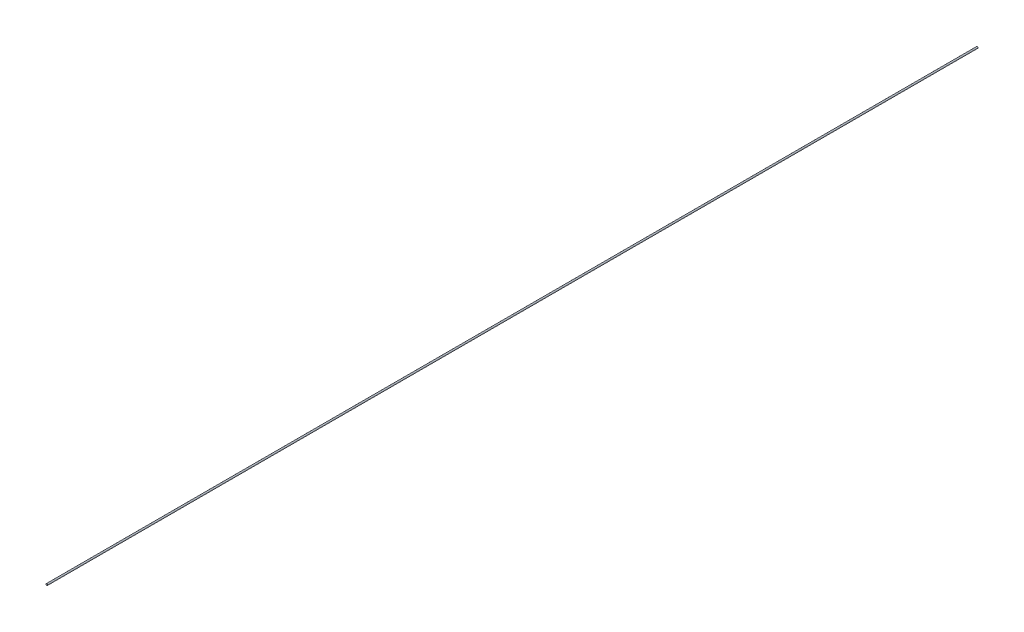
ISO-10303-21;
HEADER;
FILE_DESCRIPTION(('STEP AP214'),'2;1');
FILE_NAME('part.step','',(''),(''),'','','');
FILE_SCHEMA(('AUTOMOTIVE_DESIGN { 1 0 10303 214 1 1 1 1 }'));
ENDSEC;
DATA;
#1=APPLICATION_CONTEXT('core data for automotive mechanical design processes');
#2=APPLICATION_PROTOCOL_DEFINITION('international standard','automotive_design',2000,#1);
#3=PRODUCT_CONTEXT('',#1,'mechanical');
#4=PRODUCT('Part','Part','',(#3));
#5=PRODUCT_RELATED_PRODUCT_CATEGORY('part','',(#4));
#6=PRODUCT_DEFINITION_FORMATION('','',#4);
#7=PRODUCT_DEFINITION_CONTEXT('part definition',#1,'design');
#8=PRODUCT_DEFINITION('design','',#6,#7);
#9=PRODUCT_DEFINITION_SHAPE('','',#8);
#10=(LENGTH_UNIT() NAMED_UNIT(*) SI_UNIT(.MILLI.,.METRE.));
#11=(NAMED_UNIT(*) PLANE_ANGLE_UNIT() SI_UNIT($,.RADIAN.));
#12=(NAMED_UNIT(*) SI_UNIT($,.STERADIAN.) SOLID_ANGLE_UNIT());
#13=UNCERTAINTY_MEASURE_WITH_UNIT(LENGTH_MEASURE(1.E-05),#10,'distance_accuracy_value','');
#14=(GEOMETRIC_REPRESENTATION_CONTEXT(3) GLOBAL_UNCERTAINTY_ASSIGNED_CONTEXT((#13)) GLOBAL_UNIT_ASSIGNED_CONTEXT((#10,
#11,#12)) REPRESENTATION_CONTEXT('',''));
#15=CARTESIAN_POINT('',(0.,0.,0.));
#16=DIRECTION('',(0.,0.,1.));
#17=DIRECTION('',(1.,0.,0.));
#18=AXIS2_PLACEMENT_3D('',#15,#16,#17);
#19=CARTESIAN_POINT('',(0.,0.,400.));
#20=DIRECTION('',(0.,0.,-1.));
#21=DIRECTION('',(-1.,0.,0.));
#22=AXIS2_PLACEMENT_3D('',#19,#20,#21);
#23=CYLINDRICAL_SURFACE('',#22,0.33);
#24=CARTESIAN_POINT('',(0.,0.,400.));
#25=DIRECTION('',(0.,0.,1.));
#26=DIRECTION('',(1.,0.,0.));
#27=AXIS2_PLACEMENT_3D('',#24,#25,#26);
#28=CIRCLE('',#27,0.33);
#29=CARTESIAN_POINT('',(0.33,0.,400.));
#30=VERTEX_POINT('',#29);
#31=EDGE_CURVE('E10',#30,#30,#28,.T.);
#32=ORIENTED_EDGE('',*,*,#31,.F.);
#33=EDGE_LOOP('',(#32));
#34=FACE_BOUND('',#33,.T.);
#35=CARTESIAN_POINT('',(0.,0.,0.));
#36=DIRECTION('',(0.,0.,1.));
#37=DIRECTION('',(1.,0.,0.));
#38=AXIS2_PLACEMENT_3D('',#35,#36,#37);
#39=CIRCLE('',#38,0.33);
#40=CARTESIAN_POINT('',(0.33,0.,0.));
#41=VERTEX_POINT('',#40);
#42=EDGE_CURVE('E33',#41,#41,#39,.T.);
#43=ORIENTED_EDGE('',*,*,#42,.T.);
#44=EDGE_LOOP('',(#43));
#45=FACE_BOUND('',#44,.T.);
#46=ADVANCED_FACE('F30',(#34,#45),#23,.T.);
#47=CARTESIAN_POINT('',(0.,0.,400.));
#48=DIRECTION('',(0.,0.,1.));
#49=DIRECTION('',(1.,0.,0.));
#50=AXIS2_PLACEMENT_3D('',#47,#48,#49);
#51=PLANE('',#50);
#52=ORIENTED_EDGE('',*,*,#31,.T.);
#53=EDGE_LOOP('',(#52));
#54=FACE_BOUND('',#53,.T.);
#55=ADVANCED_FACE('F45',(#54),#51,.T.);
#56=CARTESIAN_POINT('',(0.,0.,0.));
#57=DIRECTION('',(0.,0.,1.));
#58=DIRECTION('',(1.,0.,0.));
#59=AXIS2_PLACEMENT_3D('',#56,#57,#58);
#60=PLANE('',#59);
#61=ORIENTED_EDGE('',*,*,#42,.F.);
#62=EDGE_LOOP('',(#61));
#63=FACE_BOUND('',#62,.T.);
#64=ADVANCED_FACE('F43',(#63),#60,.F.);
#65=CLOSED_SHELL('',(#46,#55,#64));
#66=MANIFOLD_SOLID_BREP('B2',#65);
#67=ADVANCED_BREP_SHAPE_REPRESENTATION('',(#18,#66),#14);
#68=SHAPE_DEFINITION_REPRESENTATION(#9,#67);
ENDSEC;
END-ISO-10303-21;
